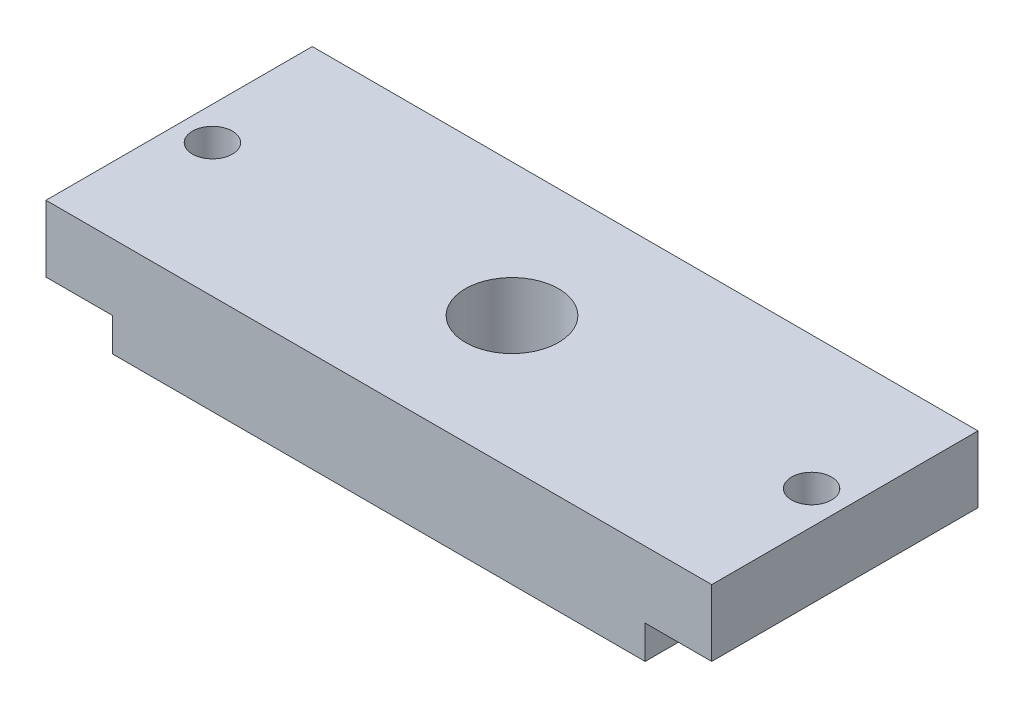
ISO-10303-21;
HEADER;
FILE_DESCRIPTION(('STEP AP214'),'2;1');
FILE_NAME('part.step','',(''),(''),'','','');
FILE_SCHEMA(('AUTOMOTIVE_DESIGN { 1 0 10303 214 1 1 1 1 }'));
ENDSEC;
DATA;
#1=APPLICATION_CONTEXT('core data for automotive mechanical design processes');
#2=APPLICATION_PROTOCOL_DEFINITION('international standard','automotive_design',2000,#1);
#3=PRODUCT_CONTEXT('',#1,'mechanical');
#4=PRODUCT('Part','Part','',(#3));
#5=PRODUCT_RELATED_PRODUCT_CATEGORY('part','',(#4));
#6=PRODUCT_DEFINITION_FORMATION('','',#4);
#7=PRODUCT_DEFINITION_CONTEXT('part definition',#1,'design');
#8=PRODUCT_DEFINITION('design','',#6,#7);
#9=PRODUCT_DEFINITION_SHAPE('','',#8);
#10=(LENGTH_UNIT() NAMED_UNIT(*) SI_UNIT(.MILLI.,.METRE.));
#11=(NAMED_UNIT(*) PLANE_ANGLE_UNIT() SI_UNIT($,.RADIAN.));
#12=(NAMED_UNIT(*) SI_UNIT($,.STERADIAN.) SOLID_ANGLE_UNIT());
#13=UNCERTAINTY_MEASURE_WITH_UNIT(LENGTH_MEASURE(1.E-05),#10,'distance_accuracy_value','');
#14=(GEOMETRIC_REPRESENTATION_CONTEXT(3) GLOBAL_UNCERTAINTY_ASSIGNED_CONTEXT((#13)) GLOBAL_UNIT_ASSIGNED_CONTEXT((#10,
#11,#12)) REPRESENTATION_CONTEXT('',''));
#15=CARTESIAN_POINT('',(0.,0.,0.));
#16=DIRECTION('',(0.,0.,1.));
#17=DIRECTION('',(1.,0.,0.));
#18=AXIS2_PLACEMENT_3D('',#15,#16,#17);
#19=CARTESIAN_POINT('',(0.,-5.,20.));
#20=DIRECTION('',(-1.,0.,0.));
#21=DIRECTION('',(0.,0.,1.));
#22=AXIS2_PLACEMENT_3D('',#19,#20,#21);
#23=PLANE('',#22);
#24=DIRECTION('',(0.,1.,0.));
#25=VECTOR('',#24,1.);
#26=CARTESIAN_POINT('',(0.,-5.,0.));
#27=LINE('',#26,#25);
#28=CARTESIAN_POINT('',(0.,-5.,0.));
#29=VERTEX_POINT('',#28);
#30=CARTESIAN_POINT('',(0.,0.,0.));
#31=VERTEX_POINT('',#30);
#32=EDGE_CURVE('E128',#29,#31,#27,.T.);
#33=ORIENTED_EDGE('',*,*,#32,.T.);
#34=DIRECTION('',(0.,0.,-1.));
#35=VECTOR('',#34,1.);
#36=CARTESIAN_POINT('',(0.,0.,20.));
#37=LINE('',#36,#35);
#38=CARTESIAN_POINT('',(0.,0.,20.));
#39=VERTEX_POINT('',#38);
#40=EDGE_CURVE('E11',#39,#31,#37,.T.);
#41=ORIENTED_EDGE('',*,*,#40,.F.);
#42=DIRECTION('',(0.,1.,0.));
#43=VECTOR('',#42,1.);
#44=CARTESIAN_POINT('',(0.,-5.,20.));
#45=LINE('',#44,#43);
#46=CARTESIAN_POINT('',(0.,-5.,20.));
#47=VERTEX_POINT('',#46);
#48=EDGE_CURVE('E142',#47,#39,#45,.T.);
#49=ORIENTED_EDGE('',*,*,#48,.F.);
#50=DIRECTION('',(0.,0.,-1.));
#51=VECTOR('',#50,1.);
#52=CARTESIAN_POINT('',(0.,-5.,20.));
#53=LINE('',#52,#51);
#54=EDGE_CURVE('E124',#47,#29,#53,.T.);
#55=ORIENTED_EDGE('',*,*,#54,.T.);
#56=EDGE_LOOP('',(#33,#41,#49,#55));
#57=FACE_BOUND('',#56,.T.);
#58=ADVANCED_FACE('F31',(#57),#23,.F.);
#59=CARTESIAN_POINT('',(0.,0.,20.));
#60=DIRECTION('',(0.,-1.,0.));
#61=DIRECTION('',(1.,0.,0.));
#62=AXIS2_PLACEMENT_3D('',#59,#60,#61);
#63=PLANE('',#62);
#64=CARTESIAN_POINT('',(-2.49999999999998,0.,10.));
#65=DIRECTION('',(0.,-1.,0.));
#66=DIRECTION('',(1.,0.,0.));
#67=AXIS2_PLACEMENT_3D('',#64,#65,#66);
#68=CIRCLE('',#67,1.5);
#69=CARTESIAN_POINT('',(-0.999999999999977,0.,10.));
#70=VERTEX_POINT('',#69);
#71=EDGE_CURVE('E185',#70,#70,#68,.T.);
#72=ORIENTED_EDGE('',*,*,#71,.T.);
#73=EDGE_LOOP('',(#72));
#74=FACE_BOUND('',#73,.T.);
#75=CARTESIAN_POINT('',(-47.5,0.,10.));
#76=DIRECTION('',(0.,-1.,0.));
#77=DIRECTION('',(1.,0.,0.));
#78=AXIS2_PLACEMENT_3D('',#75,#76,#77);
#79=CIRCLE('',#78,1.5);
#80=CARTESIAN_POINT('',(-46.,0.,10.));
#81=VERTEX_POINT('',#80);
#82=EDGE_CURVE('E179',#81,#81,#79,.T.);
#83=ORIENTED_EDGE('',*,*,#82,.T.);
#84=EDGE_LOOP('',(#83));
#85=FACE_BOUND('',#84,.T.);
#86=CARTESIAN_POINT('',(-25.,0.,10.));
#87=DIRECTION('',(0.,1.,0.));
#88=DIRECTION('',(-1.,0.,0.));
#89=AXIS2_PLACEMENT_3D('',#86,#87,#88);
#90=CIRCLE('',#89,3.5);
#91=CARTESIAN_POINT('',(-28.5,0.,10.));
#92=VERTEX_POINT('',#91);
#93=EDGE_CURVE('E176',#92,#92,#90,.T.);
#94=ORIENTED_EDGE('',*,*,#93,.F.);
#95=EDGE_LOOP('',(#94));
#96=FACE_BOUND('',#95,.T.);
#97=DIRECTION('',(-1.,0.,0.));
#98=VECTOR('',#97,1.);
#99=CARTESIAN_POINT('',(0.,0.,0.));
#100=LINE('',#99,#98);
#101=CARTESIAN_POINT('',(-50.,0.,0.));
#102=VERTEX_POINT('',#101);
#103=EDGE_CURVE('E131',#31,#102,#100,.T.);
#104=ORIENTED_EDGE('',*,*,#103,.T.);
#105=DIRECTION('',(0.,0.,-1.));
#106=VECTOR('',#105,1.);
#107=CARTESIAN_POINT('',(-50.,0.,20.));
#108=LINE('',#107,#106);
#109=CARTESIAN_POINT('',(-50.,0.,20.));
#110=VERTEX_POINT('',#109);
#111=EDGE_CURVE('E40',#110,#102,#108,.T.);
#112=ORIENTED_EDGE('',*,*,#111,.F.);
#113=DIRECTION('',(-1.,0.,0.));
#114=VECTOR('',#113,1.);
#115=CARTESIAN_POINT('',(0.,0.,20.));
#116=LINE('',#115,#114);
#117=EDGE_CURVE('E91',#39,#110,#116,.T.);
#118=ORIENTED_EDGE('',*,*,#117,.F.);
#119=ORIENTED_EDGE('',*,*,#40,.T.);
#120=EDGE_LOOP('',(#104,#112,#118,#119));
#121=FACE_BOUND('',#120,.T.);
#122=ADVANCED_FACE('F206',(#74,#85,#96,#121),#63,.F.);
#123=CARTESIAN_POINT('',(-50.,0.,20.));
#124=DIRECTION('',(1.,0.,0.));
#125=DIRECTION('',(0.,1.,0.));
#126=AXIS2_PLACEMENT_3D('',#123,#124,#125);
#127=PLANE('',#126);
#128=DIRECTION('',(0.,-1.,0.));
#129=VECTOR('',#128,1.);
#130=CARTESIAN_POINT('',(-50.,0.,0.));
#131=LINE('',#130,#129);
#132=CARTESIAN_POINT('',(-50.,-5.00000000000002,0.));
#133=VERTEX_POINT('',#132);
#134=EDGE_CURVE('E133',#102,#133,#131,.T.);
#135=ORIENTED_EDGE('',*,*,#134,.T.);
#136=DIRECTION('',(0.,0.,-1.));
#137=VECTOR('',#136,1.);
#138=CARTESIAN_POINT('',(-50.,-5.00000000000002,20.));
#139=LINE('',#138,#137);
#140=CARTESIAN_POINT('',(-50.,-5.00000000000002,20.));
#141=VERTEX_POINT('',#140);
#142=EDGE_CURVE('E149',#141,#133,#139,.T.);
#143=ORIENTED_EDGE('',*,*,#142,.F.);
#144=DIRECTION('',(0.,-1.,0.));
#145=VECTOR('',#144,1.);
#146=CARTESIAN_POINT('',(-50.,0.,20.));
#147=LINE('',#146,#145);
#148=EDGE_CURVE('E158',#110,#141,#147,.T.);
#149=ORIENTED_EDGE('',*,*,#148,.F.);
#150=ORIENTED_EDGE('',*,*,#111,.T.);
#151=EDGE_LOOP('',(#135,#143,#149,#150));
#152=FACE_BOUND('',#151,.T.);
#153=ADVANCED_FACE('F156',(#152),#127,.F.);
#154=CARTESIAN_POINT('',(-50.,-5.00000000000002,20.));
#155=DIRECTION('',(0.,1.,0.));
#156=DIRECTION('',(0.,0.,1.));
#157=AXIS2_PLACEMENT_3D('',#154,#155,#156);
#158=PLANE('',#157);
#159=CARTESIAN_POINT('',(-47.5,-5.00000000000002,10.));
#160=DIRECTION('',(0.,-1.,0.));
#161=DIRECTION('',(0.,0.,-1.));
#162=AXIS2_PLACEMENT_3D('',#159,#160,#161);
#163=CIRCLE('',#162,1.5);
#164=CARTESIAN_POINT('',(-47.5,-5.00000000000002,8.5));
#165=VERTEX_POINT('',#164);
#166=EDGE_CURVE('E182',#165,#165,#163,.T.);
#167=ORIENTED_EDGE('',*,*,#166,.F.);
#168=EDGE_LOOP('',(#167));
#169=FACE_BOUND('',#168,.T.);
#170=DIRECTION('',(1.,0.,0.));
#171=VECTOR('',#170,1.);
#172=CARTESIAN_POINT('',(-50.,-5.00000000000002,0.));
#173=LINE('',#172,#171);
#174=CARTESIAN_POINT('',(-45.,-5.00000000000002,0.));
#175=VERTEX_POINT('',#174);
#176=EDGE_CURVE('E135',#133,#175,#173,.T.);
#177=ORIENTED_EDGE('',*,*,#176,.T.);
#178=DIRECTION('',(0.,0.,-1.));
#179=VECTOR('',#178,1.);
#180=CARTESIAN_POINT('',(-45.,-5.00000000000002,20.));
#181=LINE('',#180,#179);
#182=CARTESIAN_POINT('',(-45.,-5.00000000000002,20.));
#183=VERTEX_POINT('',#182);
#184=EDGE_CURVE('E146',#183,#175,#181,.T.);
#185=ORIENTED_EDGE('',*,*,#184,.F.);
#186=DIRECTION('',(1.,0.,0.));
#187=VECTOR('',#186,1.);
#188=CARTESIAN_POINT('',(-50.,-5.00000000000002,20.));
#189=LINE('',#188,#187);
#190=EDGE_CURVE('E170',#141,#183,#189,.T.);
#191=ORIENTED_EDGE('',*,*,#190,.F.);
#192=ORIENTED_EDGE('',*,*,#142,.T.);
#193=EDGE_LOOP('',(#177,#185,#191,#192));
#194=FACE_BOUND('',#193,.T.);
#195=ADVANCED_FACE('F166',(#169,#194),#158,.F.);
#196=CARTESIAN_POINT('',(-45.,-5.00000000000002,20.));
#197=DIRECTION('',(1.,0.,0.));
#198=DIRECTION('',(0.,1.,0.));
#199=AXIS2_PLACEMENT_3D('',#196,#197,#198);
#200=PLANE('',#199);
#201=DIRECTION('',(0.,-1.,0.));
#202=VECTOR('',#201,1.);
#203=CARTESIAN_POINT('',(-45.,-5.00000000000002,0.));
#204=LINE('',#203,#202);
#205=CARTESIAN_POINT('',(-45.,-7.50000000000001,0.));
#206=VERTEX_POINT('',#205);
#207=EDGE_CURVE('E137',#175,#206,#204,.T.);
#208=ORIENTED_EDGE('',*,*,#207,.T.);
#209=DIRECTION('',(0.,0.,-1.));
#210=VECTOR('',#209,1.);
#211=CARTESIAN_POINT('',(-45.,-7.50000000000001,20.));
#212=LINE('',#211,#210);
#213=CARTESIAN_POINT('',(-45.,-7.50000000000001,20.));
#214=VERTEX_POINT('',#213);
#215=EDGE_CURVE('E119',#214,#206,#212,.T.);
#216=ORIENTED_EDGE('',*,*,#215,.F.);
#217=DIRECTION('',(0.,-1.,0.));
#218=VECTOR('',#217,1.);
#219=CARTESIAN_POINT('',(-45.,-5.00000000000002,20.));
#220=LINE('',#219,#218);
#221=EDGE_CURVE('E110',#183,#214,#220,.T.);
#222=ORIENTED_EDGE('',*,*,#221,.F.);
#223=ORIENTED_EDGE('',*,*,#184,.T.);
#224=EDGE_LOOP('',(#208,#216,#222,#223));
#225=FACE_BOUND('',#224,.T.);
#226=ADVANCED_FACE('F169',(#225),#200,.F.);
#227=CARTESIAN_POINT('',(-45.,-7.50000000000001,20.));
#228=DIRECTION('',(0.,1.,0.));
#229=DIRECTION('',(-1.,0.,0.));
#230=AXIS2_PLACEMENT_3D('',#227,#228,#229);
#231=PLANE('',#230);
#232=CARTESIAN_POINT('',(-25.,-7.50000000000001,10.));
#233=DIRECTION('',(0.,1.,0.));
#234=DIRECTION('',(-1.,0.,0.));
#235=AXIS2_PLACEMENT_3D('',#232,#233,#234);
#236=CIRCLE('',#235,3.5);
#237=CARTESIAN_POINT('',(-28.5,-7.50000000000001,10.));
#238=VERTEX_POINT('',#237);
#239=EDGE_CURVE('E34',#238,#238,#236,.T.);
#240=ORIENTED_EDGE('',*,*,#239,.T.);
#241=EDGE_LOOP('',(#240));
#242=FACE_BOUND('',#241,.T.);
#243=DIRECTION('',(1.,0.,0.));
#244=VECTOR('',#243,1.);
#245=CARTESIAN_POINT('',(-45.,-7.50000000000001,0.));
#246=LINE('',#245,#244);
#247=CARTESIAN_POINT('',(-5.00000000000002,-7.5,0.));
#248=VERTEX_POINT('',#247);
#249=EDGE_CURVE('E118',#206,#248,#246,.T.);
#250=ORIENTED_EDGE('',*,*,#249,.T.);
#251=DIRECTION('',(0.,0.,-1.));
#252=VECTOR('',#251,1.);
#253=CARTESIAN_POINT('',(-5.00000000000002,-7.5,20.));
#254=LINE('',#253,#252);
#255=CARTESIAN_POINT('',(-5.00000000000002,-7.5,20.));
#256=VERTEX_POINT('',#255);
#257=EDGE_CURVE('E115',#256,#248,#254,.T.);
#258=ORIENTED_EDGE('',*,*,#257,.F.);
#259=DIRECTION('',(1.,0.,0.));
#260=VECTOR('',#259,1.);
#261=CARTESIAN_POINT('',(-45.,-7.50000000000001,20.));
#262=LINE('',#261,#260);
#263=EDGE_CURVE('E104',#214,#256,#262,.T.);
#264=ORIENTED_EDGE('',*,*,#263,.F.);
#265=ORIENTED_EDGE('',*,*,#215,.T.);
#266=EDGE_LOOP('',(#250,#258,#264,#265));
#267=FACE_BOUND('',#266,.T.);
#268=ADVANCED_FACE('F116',(#242,#267),#231,.F.);
#269=CARTESIAN_POINT('',(-5.00000000000002,-7.5,20.));
#270=DIRECTION('',(-1.,0.,0.));
#271=DIRECTION('',(0.,-1.,0.));
#272=AXIS2_PLACEMENT_3D('',#269,#270,#271);
#273=PLANE('',#272);
#274=DIRECTION('',(0.,1.,0.));
#275=VECTOR('',#274,1.);
#276=CARTESIAN_POINT('',(-5.00000000000002,-7.5,0.));
#277=LINE('',#276,#275);
#278=CARTESIAN_POINT('',(-5.00000000000002,-5.,0.));
#279=VERTEX_POINT('',#278);
#280=EDGE_CURVE('E77',#248,#279,#277,.T.);
#281=ORIENTED_EDGE('',*,*,#280,.T.);
#282=DIRECTION('',(0.,0.,-1.));
#283=VECTOR('',#282,1.);
#284=CARTESIAN_POINT('',(-5.00000000000002,-5.,20.));
#285=LINE('',#284,#283);
#286=CARTESIAN_POINT('',(-5.00000000000002,-5.,20.));
#287=VERTEX_POINT('',#286);
#288=EDGE_CURVE('E120',#287,#279,#285,.T.);
#289=ORIENTED_EDGE('',*,*,#288,.F.);
#290=DIRECTION('',(0.,1.,0.));
#291=VECTOR('',#290,1.);
#292=CARTESIAN_POINT('',(-5.00000000000002,-7.5,20.));
#293=LINE('',#292,#291);
#294=EDGE_CURVE('E108',#256,#287,#293,.T.);
#295=ORIENTED_EDGE('',*,*,#294,.F.);
#296=ORIENTED_EDGE('',*,*,#257,.T.);
#297=EDGE_LOOP('',(#281,#289,#295,#296));
#298=FACE_BOUND('',#297,.T.);
#299=ADVANCED_FACE('F122',(#298),#273,.F.);
#300=CARTESIAN_POINT('',(-5.00000000000002,-5.,20.));
#301=DIRECTION('',(0.,1.,0.));
#302=DIRECTION('',(0.,0.,1.));
#303=AXIS2_PLACEMENT_3D('',#300,#301,#302);
#304=PLANE('',#303);
#305=CARTESIAN_POINT('',(-2.49999999999998,-5.00000000000002,10.));
#306=DIRECTION('',(0.,-1.,0.));
#307=DIRECTION('',(0.,0.,1.));
#308=AXIS2_PLACEMENT_3D('',#305,#306,#307);
#309=CIRCLE('',#308,1.5);
#310=CARTESIAN_POINT('',(-2.49999999999998,-5.00000000000002,11.5));
#311=VERTEX_POINT('',#310);
#312=EDGE_CURVE('E188',#311,#311,#309,.T.);
#313=ORIENTED_EDGE('',*,*,#312,.F.);
#314=EDGE_LOOP('',(#313));
#315=FACE_BOUND('',#314,.T.);
#316=DIRECTION('',(1.,0.,0.));
#317=VECTOR('',#316,1.);
#318=CARTESIAN_POINT('',(-5.00000000000002,-5.,0.));
#319=LINE('',#318,#317);
#320=EDGE_CURVE('E83',#279,#29,#319,.T.);
#321=ORIENTED_EDGE('',*,*,#320,.T.);
#322=ORIENTED_EDGE('',*,*,#54,.F.);
#323=DIRECTION('',(1.,0.,0.));
#324=VECTOR('',#323,1.);
#325=CARTESIAN_POINT('',(-5.00000000000002,-5.,20.));
#326=LINE('',#325,#324);
#327=EDGE_CURVE('E48',#287,#47,#326,.T.);
#328=ORIENTED_EDGE('',*,*,#327,.F.);
#329=ORIENTED_EDGE('',*,*,#288,.T.);
#330=EDGE_LOOP('',(#321,#322,#328,#329));
#331=FACE_BOUND('',#330,.T.);
#332=ADVANCED_FACE('F195',(#315,#331),#304,.F.);
#333=CARTESIAN_POINT('',(0.,-5.00000000000002,20.));
#334=DIRECTION('',(0.,0.,-1.));
#335=DIRECTION('',(-1.,0.,0.));
#336=AXIS2_PLACEMENT_3D('',#333,#334,#335);
#337=PLANE('',#336);
#338=ORIENTED_EDGE('',*,*,#48,.T.);
#339=ORIENTED_EDGE('',*,*,#117,.T.);
#340=ORIENTED_EDGE('',*,*,#148,.T.);
#341=ORIENTED_EDGE('',*,*,#190,.T.);
#342=ORIENTED_EDGE('',*,*,#221,.T.);
#343=ORIENTED_EDGE('',*,*,#263,.T.);
#344=ORIENTED_EDGE('',*,*,#294,.T.);
#345=ORIENTED_EDGE('',*,*,#327,.T.);
#346=EDGE_LOOP('',(#338,#339,#340,#341,#342,#343,#344,#345));
#347=FACE_BOUND('',#346,.T.);
#348=ADVANCED_FACE('F106',(#347),#337,.F.);
#349=CARTESIAN_POINT('',(0.,-5.00000000000002,0.));
#350=DIRECTION('',(0.,0.,-1.));
#351=DIRECTION('',(-1.,0.,0.));
#352=AXIS2_PLACEMENT_3D('',#349,#350,#351);
#353=PLANE('',#352);
#354=ORIENTED_EDGE('',*,*,#32,.F.);
#355=ORIENTED_EDGE('',*,*,#320,.F.);
#356=ORIENTED_EDGE('',*,*,#280,.F.);
#357=ORIENTED_EDGE('',*,*,#249,.F.);
#358=ORIENTED_EDGE('',*,*,#207,.F.);
#359=ORIENTED_EDGE('',*,*,#176,.F.);
#360=ORIENTED_EDGE('',*,*,#134,.F.);
#361=ORIENTED_EDGE('',*,*,#103,.F.);
#362=EDGE_LOOP('',(#354,#355,#356,#357,#358,#359,#360,#361));
#363=FACE_BOUND('',#362,.T.);
#364=ADVANCED_FACE('F162',(#363),#353,.T.);
#365=CARTESIAN_POINT('',(-25.,-20.,10.));
#366=DIRECTION('',(0.,1.,0.));
#367=DIRECTION('',(-1.,0.,0.));
#368=AXIS2_PLACEMENT_3D('',#365,#366,#367);
#369=CYLINDRICAL_SURFACE('',#368,3.5);
#370=ORIENTED_EDGE('',*,*,#93,.T.);
#371=EDGE_LOOP('',(#370));
#372=FACE_BOUND('',#371,.T.);
#373=ORIENTED_EDGE('',*,*,#239,.F.);
#374=EDGE_LOOP('',(#373));
#375=FACE_BOUND('',#374,.T.);
#376=ADVANCED_FACE('F232',(#372,#375),#369,.F.);
#377=CARTESIAN_POINT('',(-47.5,4.99999999999998,10.));
#378=DIRECTION('',(0.,-1.,0.));
#379=DIRECTION('',(0.,0.,-1.));
#380=AXIS2_PLACEMENT_3D('',#377,#378,#379);
#381=CYLINDRICAL_SURFACE('',#380,1.5);
#382=ORIENTED_EDGE('',*,*,#166,.T.);
#383=EDGE_LOOP('',(#382));
#384=FACE_BOUND('',#383,.T.);
#385=ORIENTED_EDGE('',*,*,#82,.F.);
#386=EDGE_LOOP('',(#385));
#387=FACE_BOUND('',#386,.T.);
#388=ADVANCED_FACE('F234',(#384,#387),#381,.F.);
#389=CARTESIAN_POINT('',(-2.49999999999998,4.99999999999998,10.));
#390=DIRECTION('',(0.,-1.,0.));
#391=DIRECTION('',(0.,0.,-1.));
#392=AXIS2_PLACEMENT_3D('',#389,#390,#391);
#393=CYLINDRICAL_SURFACE('',#392,1.5);
#394=ORIENTED_EDGE('',*,*,#312,.T.);
#395=EDGE_LOOP('',(#394));
#396=FACE_BOUND('',#395,.T.);
#397=ORIENTED_EDGE('',*,*,#71,.F.);
#398=EDGE_LOOP('',(#397));
#399=FACE_BOUND('',#398,.T.);
#400=ADVANCED_FACE('F192',(#396,#399),#393,.F.);
#401=CLOSED_SHELL('',(#58,#122,#153,#195,#226,#268,#299,#332,#348,#364,#376,#388,#400));
#402=MANIFOLD_SOLID_BREP('B2',#401);
#403=ADVANCED_BREP_SHAPE_REPRESENTATION('',(#18,#402),#14);
#404=SHAPE_DEFINITION_REPRESENTATION(#9,#403);
ENDSEC;
END-ISO-10303-21;
